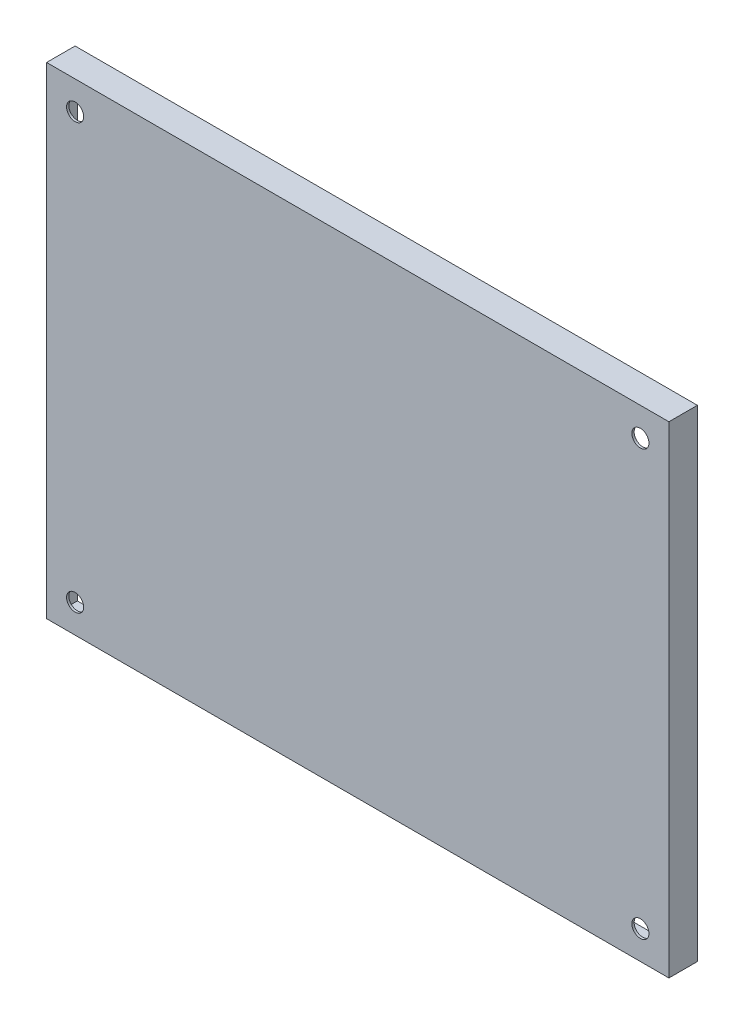
ISO-10303-21;
HEADER;
FILE_DESCRIPTION(('STEP AP214'),'2;1');
FILE_NAME('part.step','',(''),(''),'','','');
FILE_SCHEMA(('AUTOMOTIVE_DESIGN { 1 0 10303 214 1 1 1 1 }'));
ENDSEC;
DATA;
#1=APPLICATION_CONTEXT('core data for automotive mechanical design processes');
#2=APPLICATION_PROTOCOL_DEFINITION('international standard','automotive_design',2000,#1);
#3=PRODUCT_CONTEXT('',#1,'mechanical');
#4=PRODUCT('Part','Part','',(#3));
#5=PRODUCT_RELATED_PRODUCT_CATEGORY('part','',(#4));
#6=PRODUCT_DEFINITION_FORMATION('','',#4);
#7=PRODUCT_DEFINITION_CONTEXT('part definition',#1,'design');
#8=PRODUCT_DEFINITION('design','',#6,#7);
#9=PRODUCT_DEFINITION_SHAPE('','',#8);
#10=(LENGTH_UNIT() NAMED_UNIT(*) SI_UNIT(.MILLI.,.METRE.));
#11=(NAMED_UNIT(*) PLANE_ANGLE_UNIT() SI_UNIT($,.RADIAN.));
#12=(NAMED_UNIT(*) SI_UNIT($,.STERADIAN.) SOLID_ANGLE_UNIT());
#13=UNCERTAINTY_MEASURE_WITH_UNIT(LENGTH_MEASURE(1.E-05),#10,'distance_accuracy_value','');
#14=(GEOMETRIC_REPRESENTATION_CONTEXT(3) GLOBAL_UNCERTAINTY_ASSIGNED_CONTEXT((#13)) GLOBAL_UNIT_ASSIGNED_CONTEXT((#10,
#11,#12)) REPRESENTATION_CONTEXT('',''));
#15=CARTESIAN_POINT('',(0.,0.,0.));
#16=DIRECTION('',(0.,0.,1.));
#17=DIRECTION('',(1.,0.,0.));
#18=AXIS2_PLACEMENT_3D('',#15,#16,#17);
#19=CARTESIAN_POINT('',(0.,0.,0.));
#20=DIRECTION('',(0.,0.,-1.));
#21=DIRECTION('',(-1.,0.,0.));
#22=AXIS2_PLACEMENT_3D('',#19,#20,#21);
#23=PLANE('',#22);
#24=DIRECTION('',(1.,0.,0.));
#25=VECTOR('',#24,1.);
#26=CARTESIAN_POINT('',(163.8,-126.8,0.));
#27=LINE('',#26,#25);
#28=CARTESIAN_POINT('',(-163.8,-126.8,0.));
#29=VERTEX_POINT('',#28);
#30=CARTESIAN_POINT('',(163.8,-126.8,0.));
#31=VERTEX_POINT('',#30);
#32=EDGE_CURVE('E134',#29,#31,#27,.T.);
#33=ORIENTED_EDGE('',*,*,#32,.F.);
#34=DIRECTION('',(0.,-1.,0.));
#35=VECTOR('',#34,1.);
#36=CARTESIAN_POINT('',(-163.8,-126.8,0.));
#37=LINE('',#36,#35);
#38=CARTESIAN_POINT('',(-163.8,126.8,0.));
#39=VERTEX_POINT('',#38);
#40=EDGE_CURVE('E82',#39,#29,#37,.T.);
#41=ORIENTED_EDGE('',*,*,#40,.F.);
#42=DIRECTION('',(-1.,0.,0.));
#43=VECTOR('',#42,1.);
#44=CARTESIAN_POINT('',(163.8,126.8,0.));
#45=LINE('',#44,#43);
#46=CARTESIAN_POINT('',(163.8,126.8,0.));
#47=VERTEX_POINT('',#46);
#48=EDGE_CURVE('E166',#47,#39,#45,.T.);
#49=ORIENTED_EDGE('',*,*,#48,.F.);
#50=DIRECTION('',(0.,1.,0.));
#51=VECTOR('',#50,1.);
#52=CARTESIAN_POINT('',(163.8,-126.8,0.));
#53=LINE('',#52,#51);
#54=EDGE_CURVE('E138',#31,#47,#53,.T.);
#55=ORIENTED_EDGE('',*,*,#54,.F.);
#56=EDGE_LOOP('',(#33,#41,#49,#55));
#57=FACE_BOUND('',#56,.T.);
#58=DIRECTION('',(0.,-1.,0.));
#59=VECTOR('',#58,1.);
#60=CARTESIAN_POINT('',(-162.6,0.,0.));
#61=LINE('',#60,#59);
#62=CARTESIAN_POINT('',(-162.6,125.6,0.));
#63=VERTEX_POINT('',#62);
#64=CARTESIAN_POINT('',(-162.6,-125.6,0.));
#65=VERTEX_POINT('',#64);
#66=EDGE_CURVE('E129',#63,#65,#61,.T.);
#67=ORIENTED_EDGE('',*,*,#66,.T.);
#68=DIRECTION('',(1.,0.,0.));
#69=VECTOR('',#68,1.);
#70=CARTESIAN_POINT('',(0.,-125.6,0.));
#71=LINE('',#70,#69);
#72=CARTESIAN_POINT('',(162.6,-125.6,0.));
#73=VERTEX_POINT('',#72);
#74=EDGE_CURVE('E151',#65,#73,#71,.T.);
#75=ORIENTED_EDGE('',*,*,#74,.T.);
#76=DIRECTION('',(0.,1.,0.));
#77=VECTOR('',#76,1.);
#78=CARTESIAN_POINT('',(162.6,0.,0.));
#79=LINE('',#78,#77);
#80=CARTESIAN_POINT('',(162.6,125.6,0.));
#81=VERTEX_POINT('',#80);
#82=EDGE_CURVE('E133',#73,#81,#79,.T.);
#83=ORIENTED_EDGE('',*,*,#82,.T.);
#84=DIRECTION('',(-1.,0.,0.));
#85=VECTOR('',#84,1.);
#86=CARTESIAN_POINT('',(0.,125.6,0.));
#87=LINE('',#86,#85);
#88=EDGE_CURVE('E52',#81,#63,#87,.T.);
#89=ORIENTED_EDGE('',*,*,#88,.T.);
#90=EDGE_LOOP('',(#67,#75,#83,#89));
#91=FACE_BOUND('',#90,.T.);
#92=ADVANCED_FACE('F35',(#57,#91),#23,.T.);
#93=CARTESIAN_POINT('',(163.8,-126.8,15.));
#94=DIRECTION('',(0.,1.,0.));
#95=DIRECTION('',(-1.,0.,0.));
#96=AXIS2_PLACEMENT_3D('',#93,#94,#95);
#97=PLANE('',#96);
#98=ORIENTED_EDGE('',*,*,#32,.T.);
#99=DIRECTION('',(0.,0.,-1.));
#100=VECTOR('',#99,1.);
#101=CARTESIAN_POINT('',(163.8,-126.8,15.));
#102=LINE('',#101,#100);
#103=CARTESIAN_POINT('',(163.8,-126.8,15.));
#104=VERTEX_POINT('',#103);
#105=EDGE_CURVE('E11',#104,#31,#102,.T.);
#106=ORIENTED_EDGE('',*,*,#105,.F.);
#107=DIRECTION('',(1.,0.,0.));
#108=VECTOR('',#107,1.);
#109=CARTESIAN_POINT('',(163.8,-126.8,15.));
#110=LINE('',#109,#108);
#111=CARTESIAN_POINT('',(-163.8,-126.8,15.));
#112=VERTEX_POINT('',#111);
#113=EDGE_CURVE('E158',#112,#104,#110,.T.);
#114=ORIENTED_EDGE('',*,*,#113,.F.);
#115=DIRECTION('',(0.,0.,-1.));
#116=VECTOR('',#115,1.);
#117=CARTESIAN_POINT('',(-163.8,-126.8,15.));
#118=LINE('',#117,#116);
#119=EDGE_CURVE('E163',#112,#29,#118,.T.);
#120=ORIENTED_EDGE('',*,*,#119,.T.);
#121=EDGE_LOOP('',(#98,#106,#114,#120));
#122=FACE_BOUND('',#121,.T.);
#123=ADVANCED_FACE('F37',(#122),#97,.F.);
#124=CARTESIAN_POINT('',(163.8,-126.8,15.));
#125=DIRECTION('',(-1.,0.,0.));
#126=DIRECTION('',(0.,-1.,0.));
#127=AXIS2_PLACEMENT_3D('',#124,#125,#126);
#128=PLANE('',#127);
#129=ORIENTED_EDGE('',*,*,#54,.T.);
#130=DIRECTION('',(0.,0.,-1.));
#131=VECTOR('',#130,1.);
#132=CARTESIAN_POINT('',(163.8,126.8,15.));
#133=LINE('',#132,#131);
#134=CARTESIAN_POINT('',(163.8,126.8,15.));
#135=VERTEX_POINT('',#134);
#136=EDGE_CURVE('E44',#135,#47,#133,.T.);
#137=ORIENTED_EDGE('',*,*,#136,.F.);
#138=DIRECTION('',(0.,1.,0.));
#139=VECTOR('',#138,1.);
#140=CARTESIAN_POINT('',(163.8,-126.8,15.));
#141=LINE('',#140,#139);
#142=EDGE_CURVE('E89',#104,#135,#141,.T.);
#143=ORIENTED_EDGE('',*,*,#142,.F.);
#144=ORIENTED_EDGE('',*,*,#105,.T.);
#145=EDGE_LOOP('',(#129,#137,#143,#144));
#146=FACE_BOUND('',#145,.T.);
#147=ADVANCED_FACE('F200',(#146),#128,.F.);
#148=CARTESIAN_POINT('',(163.8,126.8,15.));
#149=DIRECTION('',(0.,-1.,0.));
#150=DIRECTION('',(1.,0.,0.));
#151=AXIS2_PLACEMENT_3D('',#148,#149,#150);
#152=PLANE('',#151);
#153=ORIENTED_EDGE('',*,*,#48,.T.);
#154=DIRECTION('',(0.,0.,-1.));
#155=VECTOR('',#154,1.);
#156=CARTESIAN_POINT('',(-163.8,126.8,15.));
#157=LINE('',#156,#155);
#158=CARTESIAN_POINT('',(-163.8,126.8,15.));
#159=VERTEX_POINT('',#158);
#160=EDGE_CURVE('E170',#159,#39,#157,.T.);
#161=ORIENTED_EDGE('',*,*,#160,.F.);
#162=DIRECTION('',(-1.,0.,0.));
#163=VECTOR('',#162,1.);
#164=CARTESIAN_POINT('',(163.8,126.8,15.));
#165=LINE('',#164,#163);
#166=EDGE_CURVE('E161',#135,#159,#165,.T.);
#167=ORIENTED_EDGE('',*,*,#166,.F.);
#168=ORIENTED_EDGE('',*,*,#136,.T.);
#169=EDGE_LOOP('',(#153,#161,#167,#168));
#170=FACE_BOUND('',#169,.T.);
#171=ADVANCED_FACE('F205',(#170),#152,.F.);
#172=CARTESIAN_POINT('',(-163.8,-126.8,15.));
#173=DIRECTION('',(1.,0.,0.));
#174=DIRECTION('',(0.,0.,-1.));
#175=AXIS2_PLACEMENT_3D('',#172,#173,#174);
#176=PLANE('',#175);
#177=ORIENTED_EDGE('',*,*,#40,.T.);
#178=ORIENTED_EDGE('',*,*,#119,.F.);
#179=DIRECTION('',(0.,-1.,0.));
#180=VECTOR('',#179,1.);
#181=CARTESIAN_POINT('',(-163.8,-126.8,15.));
#182=LINE('',#181,#180);
#183=EDGE_CURVE('E61',#159,#112,#182,.T.);
#184=ORIENTED_EDGE('',*,*,#183,.F.);
#185=ORIENTED_EDGE('',*,*,#160,.T.);
#186=EDGE_LOOP('',(#177,#178,#184,#185));
#187=FACE_BOUND('',#186,.T.);
#188=ADVANCED_FACE('F193',(#187),#176,.F.);
#189=CARTESIAN_POINT('',(0.,0.,15.));
#190=DIRECTION('',(0.,0.,-1.));
#191=DIRECTION('',(-1.,0.,0.));
#192=AXIS2_PLACEMENT_3D('',#189,#190,#191);
#193=PLANE('',#192);
#194=CARTESIAN_POINT('',(148.8,111.8,15.));
#195=DIRECTION('',(0.,0.,1.));
#196=DIRECTION('',(-1.,0.,0.));
#197=AXIS2_PLACEMENT_3D('',#194,#195,#196);
#198=CIRCLE('',#197,4.49999999999999);
#199=CARTESIAN_POINT('',(144.3,111.8,15.));
#200=VERTEX_POINT('',#199);
#201=EDGE_CURVE('E179',#200,#200,#198,.T.);
#202=ORIENTED_EDGE('',*,*,#201,.F.);
#203=EDGE_LOOP('',(#202));
#204=FACE_BOUND('',#203,.T.);
#205=CARTESIAN_POINT('',(148.8,-111.8,15.));
#206=DIRECTION('',(0.,0.,1.));
#207=DIRECTION('',(1.,0.,0.));
#208=AXIS2_PLACEMENT_3D('',#205,#206,#207);
#209=CIRCLE('',#208,4.50000000000001);
#210=CARTESIAN_POINT('',(153.3,-111.8,15.));
#211=VERTEX_POINT('',#210);
#212=EDGE_CURVE('E324',#211,#211,#209,.T.);
#213=ORIENTED_EDGE('',*,*,#212,.F.);
#214=EDGE_LOOP('',(#213));
#215=FACE_BOUND('',#214,.T.);
#216=CARTESIAN_POINT('',(-148.8,-111.8,15.));
#217=DIRECTION('',(0.,0.,1.));
#218=DIRECTION('',(-1.,0.,0.));
#219=AXIS2_PLACEMENT_3D('',#216,#217,#218);
#220=CIRCLE('',#219,4.49999999999996);
#221=CARTESIAN_POINT('',(-153.3,-111.8,15.));
#222=VERTEX_POINT('',#221);
#223=EDGE_CURVE('E327',#222,#222,#220,.T.);
#224=ORIENTED_EDGE('',*,*,#223,.F.);
#225=EDGE_LOOP('',(#224));
#226=FACE_BOUND('',#225,.T.);
#227=CARTESIAN_POINT('',(-148.8,111.8,15.));
#228=DIRECTION('',(0.,0.,1.));
#229=DIRECTION('',(1.,0.,0.));
#230=AXIS2_PLACEMENT_3D('',#227,#228,#229);
#231=CIRCLE('',#230,4.49999999999999);
#232=CARTESIAN_POINT('',(-144.3,111.8,15.));
#233=VERTEX_POINT('',#232);
#234=EDGE_CURVE('E143',#233,#233,#231,.T.);
#235=ORIENTED_EDGE('',*,*,#234,.F.);
#236=EDGE_LOOP('',(#235));
#237=FACE_BOUND('',#236,.T.);
#238=ORIENTED_EDGE('',*,*,#113,.T.);
#239=ORIENTED_EDGE('',*,*,#142,.T.);
#240=ORIENTED_EDGE('',*,*,#166,.T.);
#241=ORIENTED_EDGE('',*,*,#183,.T.);
#242=EDGE_LOOP('',(#238,#239,#240,#241));
#243=FACE_BOUND('',#242,.T.);
#244=ADVANCED_FACE('F191',(#204,#215,#226,#237,#243),#193,.F.);
#245=CARTESIAN_POINT('',(163.8,-125.6,15.));
#246=DIRECTION('',(0.,1.,0.));
#247=DIRECTION('',(-1.,0.,0.));
#248=AXIS2_PLACEMENT_3D('',#245,#246,#247);
#249=PLANE('',#248);
#250=ORIENTED_EDGE('',*,*,#74,.F.);
#251=DIRECTION('',(0.,0.,-1.));
#252=VECTOR('',#251,1.);
#253=CARTESIAN_POINT('',(-162.6,-125.6,15.));
#254=LINE('',#253,#252);
#255=CARTESIAN_POINT('',(-162.6,-125.6,13.8));
#256=VERTEX_POINT('',#255);
#257=EDGE_CURVE('E128',#256,#65,#254,.T.);
#258=ORIENTED_EDGE('',*,*,#257,.F.);
#259=DIRECTION('',(1.,0.,0.));
#260=VECTOR('',#259,1.);
#261=CARTESIAN_POINT('',(0.,-125.6,13.8));
#262=LINE('',#261,#260);
#263=CARTESIAN_POINT('',(162.6,-125.6,13.8));
#264=VERTEX_POINT('',#263);
#265=EDGE_CURVE('E116',#256,#264,#262,.T.);
#266=ORIENTED_EDGE('',*,*,#265,.T.);
#267=DIRECTION('',(0.,0.,-1.));
#268=VECTOR('',#267,1.);
#269=CARTESIAN_POINT('',(162.6,-125.6,15.));
#270=LINE('',#269,#268);
#271=EDGE_CURVE('E126',#264,#73,#270,.T.);
#272=ORIENTED_EDGE('',*,*,#271,.T.);
#273=EDGE_LOOP('',(#250,#258,#266,#272));
#274=FACE_BOUND('',#273,.T.);
#275=ADVANCED_FACE('F125',(#274),#249,.T.);
#276=CARTESIAN_POINT('',(162.6,-126.8,15.));
#277=DIRECTION('',(-1.,0.,0.));
#278=DIRECTION('',(0.,-1.,0.));
#279=AXIS2_PLACEMENT_3D('',#276,#277,#278);
#280=PLANE('',#279);
#281=ORIENTED_EDGE('',*,*,#82,.F.);
#282=ORIENTED_EDGE('',*,*,#271,.F.);
#283=DIRECTION('',(0.,1.,0.));
#284=VECTOR('',#283,1.);
#285=CARTESIAN_POINT('',(162.6,0.,13.8));
#286=LINE('',#285,#284);
#287=CARTESIAN_POINT('',(162.6,125.6,13.8));
#288=VERTEX_POINT('',#287);
#289=EDGE_CURVE('E112',#264,#288,#286,.T.);
#290=ORIENTED_EDGE('',*,*,#289,.T.);
#291=DIRECTION('',(0.,0.,-1.));
#292=VECTOR('',#291,1.);
#293=CARTESIAN_POINT('',(162.6,125.6,15.));
#294=LINE('',#293,#292);
#295=EDGE_CURVE('E135',#288,#81,#294,.T.);
#296=ORIENTED_EDGE('',*,*,#295,.T.);
#297=EDGE_LOOP('',(#281,#282,#290,#296));
#298=FACE_BOUND('',#297,.T.);
#299=ADVANCED_FACE('F131',(#298),#280,.T.);
#300=CARTESIAN_POINT('',(163.8,125.6,15.));
#301=DIRECTION('',(0.,-1.,0.));
#302=DIRECTION('',(1.,0.,0.));
#303=AXIS2_PLACEMENT_3D('',#300,#301,#302);
#304=PLANE('',#303);
#305=ORIENTED_EDGE('',*,*,#88,.F.);
#306=ORIENTED_EDGE('',*,*,#295,.F.);
#307=DIRECTION('',(-1.,0.,0.));
#308=VECTOR('',#307,1.);
#309=CARTESIAN_POINT('',(0.,125.6,13.8));
#310=LINE('',#309,#308);
#311=CARTESIAN_POINT('',(-162.6,125.6,13.8));
#312=VERTEX_POINT('',#311);
#313=EDGE_CURVE('E117',#288,#312,#310,.T.);
#314=ORIENTED_EDGE('',*,*,#313,.T.);
#315=DIRECTION('',(0.,0.,-1.));
#316=VECTOR('',#315,1.);
#317=CARTESIAN_POINT('',(-162.6,125.6,15.));
#318=LINE('',#317,#316);
#319=EDGE_CURVE('E140',#312,#63,#318,.T.);
#320=ORIENTED_EDGE('',*,*,#319,.T.);
#321=EDGE_LOOP('',(#305,#306,#314,#320));
#322=FACE_BOUND('',#321,.T.);
#323=ADVANCED_FACE('F214',(#322),#304,.T.);
#324=CARTESIAN_POINT('',(-162.6,-126.8,15.));
#325=DIRECTION('',(1.,0.,0.));
#326=DIRECTION('',(0.,0.,-1.));
#327=AXIS2_PLACEMENT_3D('',#324,#325,#326);
#328=PLANE('',#327);
#329=ORIENTED_EDGE('',*,*,#66,.F.);
#330=ORIENTED_EDGE('',*,*,#319,.F.);
#331=DIRECTION('',(0.,-1.,0.));
#332=VECTOR('',#331,1.);
#333=CARTESIAN_POINT('',(-162.6,0.,13.8));
#334=LINE('',#333,#332);
#335=EDGE_CURVE('E146',#312,#256,#334,.T.);
#336=ORIENTED_EDGE('',*,*,#335,.T.);
#337=ORIENTED_EDGE('',*,*,#257,.T.);
#338=EDGE_LOOP('',(#329,#330,#336,#337));
#339=FACE_BOUND('',#338,.T.);
#340=ADVANCED_FACE('F213',(#339),#328,.T.);
#341=CARTESIAN_POINT('',(0.,0.,13.8));
#342=DIRECTION('',(0.,0.,-1.));
#343=DIRECTION('',(-1.,0.,0.));
#344=AXIS2_PLACEMENT_3D('',#341,#342,#343);
#345=PLANE('',#344);
#346=CARTESIAN_POINT('',(148.8,111.8,13.8));
#347=DIRECTION('',(0.,0.,-1.));
#348=DIRECTION('',(-1.,0.,0.));
#349=AXIS2_PLACEMENT_3D('',#346,#347,#348);
#350=CIRCLE('',#349,4.49999999999999);
#351=CARTESIAN_POINT('',(144.3,111.8,13.8));
#352=VERTEX_POINT('',#351);
#353=EDGE_CURVE('E39',#352,#352,#350,.T.);
#354=ORIENTED_EDGE('',*,*,#353,.F.);
#355=EDGE_LOOP('',(#354));
#356=FACE_BOUND('',#355,.T.);
#357=CARTESIAN_POINT('',(148.8,-111.8,13.8));
#358=DIRECTION('',(0.,0.,-1.));
#359=DIRECTION('',(-1.,0.,0.));
#360=AXIS2_PLACEMENT_3D('',#357,#358,#359);
#361=CIRCLE('',#360,4.50000000000001);
#362=CARTESIAN_POINT('',(144.3,-111.8,13.8));
#363=VERTEX_POINT('',#362);
#364=EDGE_CURVE('E178',#363,#363,#361,.T.);
#365=ORIENTED_EDGE('',*,*,#364,.F.);
#366=EDGE_LOOP('',(#365));
#367=FACE_BOUND('',#366,.T.);
#368=CARTESIAN_POINT('',(-148.8,-111.8,13.8));
#369=DIRECTION('',(0.,0.,-1.));
#370=DIRECTION('',(-1.,0.,0.));
#371=AXIS2_PLACEMENT_3D('',#368,#369,#370);
#372=CIRCLE('',#371,4.49999999999996);
#373=CARTESIAN_POINT('',(-153.3,-111.8,13.8));
#374=VERTEX_POINT('',#373);
#375=EDGE_CURVE('E176',#374,#374,#372,.T.);
#376=ORIENTED_EDGE('',*,*,#375,.F.);
#377=EDGE_LOOP('',(#376));
#378=FACE_BOUND('',#377,.T.);
#379=CARTESIAN_POINT('',(-148.8,111.8,13.8));
#380=DIRECTION('',(0.,0.,-1.));
#381=DIRECTION('',(-1.,0.,0.));
#382=AXIS2_PLACEMENT_3D('',#379,#380,#381);
#383=CIRCLE('',#382,4.49999999999999);
#384=CARTESIAN_POINT('',(-153.3,111.8,13.8));
#385=VERTEX_POINT('',#384);
#386=EDGE_CURVE('E153',#385,#385,#383,.T.);
#387=ORIENTED_EDGE('',*,*,#386,.F.);
#388=EDGE_LOOP('',(#387));
#389=FACE_BOUND('',#388,.T.);
#390=ORIENTED_EDGE('',*,*,#265,.F.);
#391=ORIENTED_EDGE('',*,*,#335,.F.);
#392=ORIENTED_EDGE('',*,*,#313,.F.);
#393=ORIENTED_EDGE('',*,*,#289,.F.);
#394=EDGE_LOOP('',(#390,#391,#392,#393));
#395=FACE_BOUND('',#394,.T.);
#396=ADVANCED_FACE('F114',(#356,#367,#378,#389,#395),#345,.T.);
#397=CARTESIAN_POINT('',(-148.8,111.8,0.));
#398=DIRECTION('',(0.,0.,1.));
#399=DIRECTION('',(1.,0.,0.));
#400=AXIS2_PLACEMENT_3D('',#397,#398,#399);
#401=CYLINDRICAL_SURFACE('',#400,4.49999999999999);
#402=ORIENTED_EDGE('',*,*,#386,.T.);
#403=EDGE_LOOP('',(#402));
#404=FACE_BOUND('',#403,.T.);
#405=ORIENTED_EDGE('',*,*,#234,.T.);
#406=EDGE_LOOP('',(#405));
#407=FACE_BOUND('',#406,.T.);
#408=ADVANCED_FACE('F189',(#404,#407),#401,.F.);
#409=CARTESIAN_POINT('',(-148.8,-111.8,0.));
#410=DIRECTION('',(0.,0.,1.));
#411=DIRECTION('',(1.,0.,0.));
#412=AXIS2_PLACEMENT_3D('',#409,#410,#411);
#413=CYLINDRICAL_SURFACE('',#412,4.49999999999996);
#414=ORIENTED_EDGE('',*,*,#375,.T.);
#415=EDGE_LOOP('',(#414));
#416=FACE_BOUND('',#415,.T.);
#417=ORIENTED_EDGE('',*,*,#223,.T.);
#418=EDGE_LOOP('',(#417));
#419=FACE_BOUND('',#418,.T.);
#420=ADVANCED_FACE('F289',(#416,#419),#413,.F.);
#421=CARTESIAN_POINT('',(148.8,-111.8,0.));
#422=DIRECTION('',(0.,0.,1.));
#423=DIRECTION('',(1.,0.,0.));
#424=AXIS2_PLACEMENT_3D('',#421,#422,#423);
#425=CYLINDRICAL_SURFACE('',#424,4.50000000000001);
#426=ORIENTED_EDGE('',*,*,#364,.T.);
#427=EDGE_LOOP('',(#426));
#428=FACE_BOUND('',#427,.T.);
#429=ORIENTED_EDGE('',*,*,#212,.T.);
#430=EDGE_LOOP('',(#429));
#431=FACE_BOUND('',#430,.T.);
#432=ADVANCED_FACE('F299',(#428,#431),#425,.F.);
#433=CARTESIAN_POINT('',(148.8,111.8,0.));
#434=DIRECTION('',(0.,0.,1.));
#435=DIRECTION('',(1.,0.,0.));
#436=AXIS2_PLACEMENT_3D('',#433,#434,#435);
#437=CYLINDRICAL_SURFACE('',#436,4.49999999999999);
#438=ORIENTED_EDGE('',*,*,#353,.T.);
#439=EDGE_LOOP('',(#438));
#440=FACE_BOUND('',#439,.T.);
#441=ORIENTED_EDGE('',*,*,#201,.T.);
#442=EDGE_LOOP('',(#441));
#443=FACE_BOUND('',#442,.T.);
#444=ADVANCED_FACE('F309',(#440,#443),#437,.F.);
#445=CLOSED_SHELL('',(#92,#123,#147,#171,#188,#244,#275,#299,#323,#340,#396,#408,#420,#432,#444));
#446=MANIFOLD_SOLID_BREP('B2',#445);
#447=ADVANCED_BREP_SHAPE_REPRESENTATION('',(#18,#446),#14);
#448=SHAPE_DEFINITION_REPRESENTATION(#9,#447);
ENDSEC;
END-ISO-10303-21;
